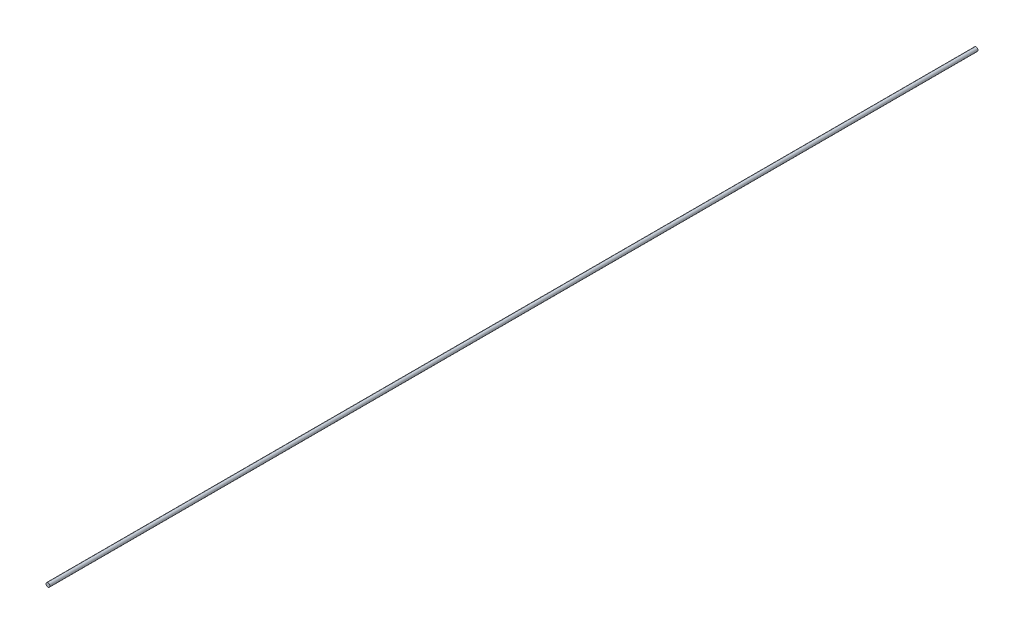
ISO-10303-21;
HEADER;
FILE_DESCRIPTION(('STEP AP214'),'2;1');
FILE_NAME('part.step','',(''),(''),'','','');
FILE_SCHEMA(('AUTOMOTIVE_DESIGN { 1 0 10303 214 1 1 1 1 }'));
ENDSEC;
DATA;
#1=APPLICATION_CONTEXT('core data for automotive mechanical design processes');
#2=APPLICATION_PROTOCOL_DEFINITION('international standard','automotive_design',2000,#1);
#3=PRODUCT_CONTEXT('',#1,'mechanical');
#4=PRODUCT('Part','Part','',(#3));
#5=PRODUCT_RELATED_PRODUCT_CATEGORY('part','',(#4));
#6=PRODUCT_DEFINITION_FORMATION('','',#4);
#7=PRODUCT_DEFINITION_CONTEXT('part definition',#1,'design');
#8=PRODUCT_DEFINITION('design','',#6,#7);
#9=PRODUCT_DEFINITION_SHAPE('','',#8);
#10=(LENGTH_UNIT() NAMED_UNIT(*) SI_UNIT(.MILLI.,.METRE.));
#11=(NAMED_UNIT(*) PLANE_ANGLE_UNIT() SI_UNIT($,.RADIAN.));
#12=(NAMED_UNIT(*) SI_UNIT($,.STERADIAN.) SOLID_ANGLE_UNIT());
#13=UNCERTAINTY_MEASURE_WITH_UNIT(LENGTH_MEASURE(1.E-05),#10,'distance_accuracy_value','');
#14=(GEOMETRIC_REPRESENTATION_CONTEXT(3) GLOBAL_UNCERTAINTY_ASSIGNED_CONTEXT((#13)) GLOBAL_UNIT_ASSIGNED_CONTEXT((#10,
#11,#12)) REPRESENTATION_CONTEXT('',''));
#15=CARTESIAN_POINT('',(0.,0.,0.));
#16=DIRECTION('',(0.,0.,1.));
#17=DIRECTION('',(1.,0.,0.));
#18=AXIS2_PLACEMENT_3D('',#15,#16,#17);
#19=CARTESIAN_POINT('',(-44.7215267955278,-1.87202950914363,-766.489874060534));
#20=DIRECTION('',(0.,0.,1.));
#21=DIRECTION('',(1.,0.,0.));
#22=AXIS2_PLACEMENT_3D('',#19,#20,#21);
#23=CYLINDRICAL_SURFACE('',#22,1.5875);
#24=CARTESIAN_POINT('',(-44.7215267955278,-1.87202950914363,-761.999746));
#25=DIRECTION('',(0.,0.,1.));
#26=DIRECTION('',(1.,0.,0.));
#27=AXIS2_PLACEMENT_3D('',#24,#25,#26);
#28=CIRCLE('',#27,1.5875);
#29=CARTESIAN_POINT('',(-43.1340267955278,-1.87202950914363,-761.999746));
#30=VERTEX_POINT('',#29);
#31=EDGE_CURVE('E10',#30,#30,#28,.F.);
#32=ORIENTED_EDGE('',*,*,#31,.F.);
#33=EDGE_LOOP('',(#32));
#34=FACE_BOUND('',#33,.T.);
#35=CARTESIAN_POINT('',(-44.7215267955278,-1.87202950914363,0.));
#36=DIRECTION('',(0.,0.,1.));
#37=DIRECTION('',(1.,0.,0.));
#38=AXIS2_PLACEMENT_3D('',#35,#36,#37);
#39=CIRCLE('',#38,1.5875);
#40=CARTESIAN_POINT('',(-43.1340267955278,-1.87202950914363,0.));
#41=VERTEX_POINT('',#40);
#42=EDGE_CURVE('E46',#41,#41,#39,.T.);
#43=ORIENTED_EDGE('',*,*,#42,.F.);
#44=EDGE_LOOP('',(#43));
#45=FACE_BOUND('',#44,.T.);
#46=ADVANCED_FACE('F39',(#34,#45),#23,.T.);
#47=CARTESIAN_POINT('',(-44.7215267955278,-1.87202950914363,0.));
#48=DIRECTION('',(0.,0.,1.));
#49=DIRECTION('',(1.,0.,0.));
#50=AXIS2_PLACEMENT_3D('',#47,#48,#49);
#51=PLANE('',#50);
#52=ORIENTED_EDGE('',*,*,#42,.T.);
#53=EDGE_LOOP('',(#52));
#54=FACE_BOUND('',#53,.T.);
#55=ADVANCED_FACE('F52',(#54),#51,.T.);
#56=CARTESIAN_POINT('',(10.2783454417971,2.5845685138359,-761.999746));
#57=DIRECTION('',(0.,0.,1.));
#58=DIRECTION('',(1.,0.,0.));
#59=AXIS2_PLACEMENT_3D('',#56,#57,#58);
#60=PLANE('',#59);
#61=ORIENTED_EDGE('',*,*,#31,.T.);
#62=EDGE_LOOP('',(#61));
#63=FACE_BOUND('',#62,.T.);
#64=ADVANCED_FACE('F41',(#63),#60,.F.);
#65=CLOSED_SHELL('',(#46,#55,#64));
#66=MANIFOLD_SOLID_BREP('B2',#65);
#67=ADVANCED_BREP_SHAPE_REPRESENTATION('',(#18,#66),#14);
#68=SHAPE_DEFINITION_REPRESENTATION(#9,#67);
ENDSEC;
END-ISO-10303-21;
